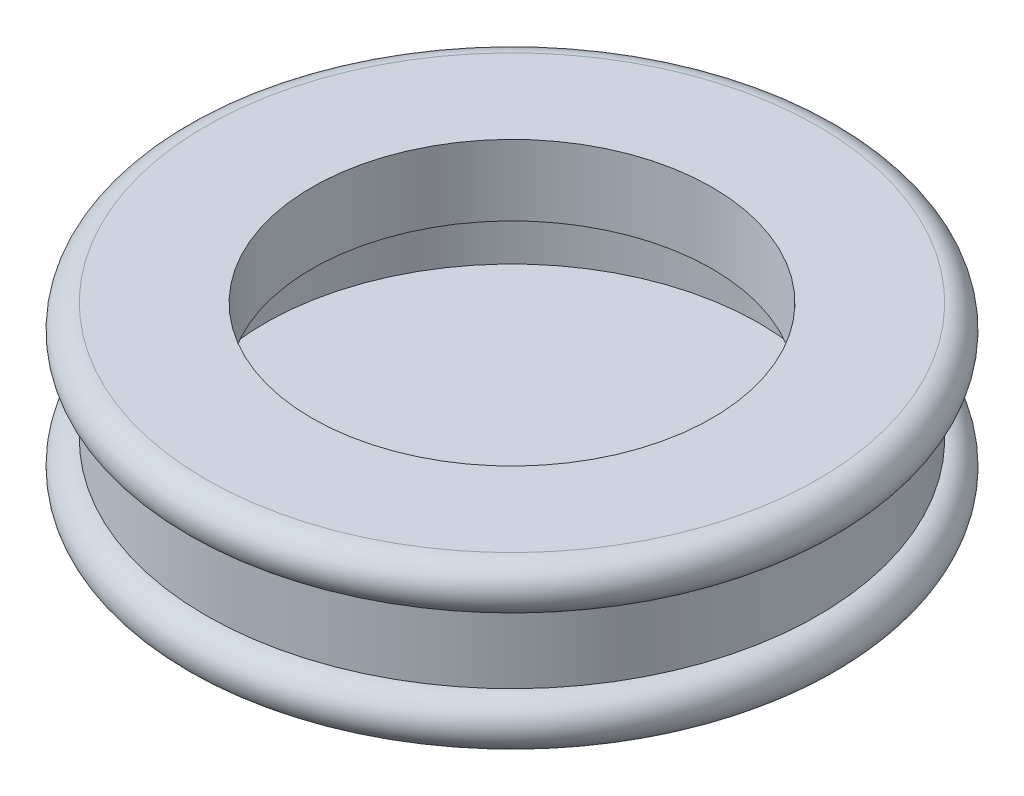
ISO-10303-21;
HEADER;
FILE_DESCRIPTION(('STEP AP214'),'2;1');
FILE_NAME('part.step','',(''),(''),'','','');
FILE_SCHEMA(('AUTOMOTIVE_DESIGN { 1 0 10303 214 1 1 1 1 }'));
ENDSEC;
DATA;
#1=APPLICATION_CONTEXT('core data for automotive mechanical design processes');
#2=APPLICATION_PROTOCOL_DEFINITION('international standard','automotive_design',2000,#1);
#3=PRODUCT_CONTEXT('',#1,'mechanical');
#4=PRODUCT('Part','Part','',(#3));
#5=PRODUCT_RELATED_PRODUCT_CATEGORY('part','',(#4));
#6=PRODUCT_DEFINITION_FORMATION('','',#4);
#7=PRODUCT_DEFINITION_CONTEXT('part definition',#1,'design');
#8=PRODUCT_DEFINITION('design','',#6,#7);
#9=PRODUCT_DEFINITION_SHAPE('','',#8);
#10=(LENGTH_UNIT() NAMED_UNIT(*) SI_UNIT(.MILLI.,.METRE.));
#11=(NAMED_UNIT(*) PLANE_ANGLE_UNIT() SI_UNIT($,.RADIAN.));
#12=(NAMED_UNIT(*) SI_UNIT($,.STERADIAN.) SOLID_ANGLE_UNIT());
#13=UNCERTAINTY_MEASURE_WITH_UNIT(LENGTH_MEASURE(1.E-05),#10,'distance_accuracy_value','');
#14=(GEOMETRIC_REPRESENTATION_CONTEXT(3) GLOBAL_UNCERTAINTY_ASSIGNED_CONTEXT((#13)) GLOBAL_UNIT_ASSIGNED_CONTEXT((#10,
#11,#12)) REPRESENTATION_CONTEXT('',''));
#15=CARTESIAN_POINT('',(0.,0.,0.));
#16=DIRECTION('',(0.,0.,1.));
#17=DIRECTION('',(1.,0.,0.));
#18=AXIS2_PLACEMENT_3D('',#15,#16,#17);
#19=CARTESIAN_POINT('',(0.,0.,0.));
#20=DIRECTION('',(0.,1.,0.));
#21=DIRECTION('',(0.,0.,1.));
#22=AXIS2_PLACEMENT_3D('',#19,#20,#21);
#23=CONICAL_SURFACE('',#22,0.,1.4198658206465);
#24=CARTESIAN_POINT('',(0.,2.,0.));
#25=DIRECTION('',(0.,-1.,0.));
#26=DIRECTION('',(0.,0.,-1.));
#27=AXIS2_PLACEMENT_3D('',#24,#25,#26);
#28=CIRCLE('',#27,13.1503581252133);
#29=CARTESIAN_POINT('',(0.,2.,-13.1503581252134));
#30=VERTEX_POINT('',#29);
#31=EDGE_CURVE('E11',#30,#30,#28,.T.);
#32=ORIENTED_EDGE('',*,*,#31,.T.);
#33=EDGE_LOOP('',(#32));
#34=FACE_BOUND('',#33,.T.);
#35=CARTESIAN_POINT('',(0.,0.,0.));
#36=VERTEX_POINT('',#35);
#37=VERTEX_LOOP('',#36);
#38=FACE_BOUND('',#37,.T.);
#39=ADVANCED_FACE('F42',(#34,#38),#23,.T.);
#40=CARTESIAN_POINT('',(0.,2.98863159679546,0.));
#41=DIRECTION('',(0.,-1.,0.));
#42=DIRECTION('',(0.,0.,-1.));
#43=AXIS2_PLACEMENT_3D('',#40,#41,#42);
#44=TOROIDAL_SURFACE('',#43,13.,1.);
#45=CARTESIAN_POINT('',(0.,3.98863159679546,0.));
#46=DIRECTION('',(0.,-1.,0.));
#47=DIRECTION('',(0.,0.,-1.));
#48=AXIS2_PLACEMENT_3D('',#45,#46,#47);
#49=CIRCLE('',#48,13.);
#50=CARTESIAN_POINT('',(0.,3.98863159679546,-13.));
#51=VERTEX_POINT('',#50);
#52=EDGE_CURVE('E49',#51,#51,#49,.T.);
#53=ORIENTED_EDGE('',*,*,#52,.T.);
#54=EDGE_LOOP('',(#53));
#55=FACE_BOUND('',#54,.T.);
#56=ORIENTED_EDGE('',*,*,#31,.F.);
#57=EDGE_LOOP('',(#56));
#58=FACE_BOUND('',#57,.T.);
#59=ADVANCED_FACE('F53',(#55,#58),#44,.T.);
#60=CARTESIAN_POINT('',(0.,0.,0.));
#61=DIRECTION('',(0.,-1.,0.));
#62=DIRECTION('',(0.,0.,-1.));
#63=AXIS2_PLACEMENT_3D('',#60,#61,#62);
#64=CYLINDRICAL_SURFACE('',#63,13.);
#65=CARTESIAN_POINT('',(0.,6.99838498756551,0.));
#66=DIRECTION('',(0.,-1.,0.));
#67=DIRECTION('',(0.,0.,-1.));
#68=AXIS2_PLACEMENT_3D('',#65,#66,#67);
#69=CIRCLE('',#68,13.);
#70=CARTESIAN_POINT('',(0.,6.99838498756551,-13.));
#71=VERTEX_POINT('',#70);
#72=EDGE_CURVE('E117',#71,#71,#69,.T.);
#73=ORIENTED_EDGE('',*,*,#72,.T.);
#74=EDGE_LOOP('',(#73));
#75=FACE_BOUND('',#74,.T.);
#76=ORIENTED_EDGE('',*,*,#52,.F.);
#77=EDGE_LOOP('',(#76));
#78=FACE_BOUND('',#77,.T.);
#79=ADVANCED_FACE('F58',(#75,#78),#64,.T.);
#80=CARTESIAN_POINT('',(0.,7.99838498756551,0.));
#81=DIRECTION('',(0.,-1.,0.));
#82=DIRECTION('',(0.,0.,-1.));
#83=AXIS2_PLACEMENT_3D('',#80,#81,#82);
#84=TOROIDAL_SURFACE('',#83,13.,1.);
#85=CARTESIAN_POINT('',(0.,8.99838498756551,0.));
#86=DIRECTION('',(0.,-1.,0.));
#87=DIRECTION('',(0.,0.,-1.));
#88=AXIS2_PLACEMENT_3D('',#85,#86,#87);
#89=CIRCLE('',#88,13.);
#90=CARTESIAN_POINT('',(0.,8.99838498756551,-13.));
#91=VERTEX_POINT('',#90);
#92=EDGE_CURVE('E113',#91,#91,#89,.T.);
#93=ORIENTED_EDGE('',*,*,#92,.T.);
#94=EDGE_LOOP('',(#93));
#95=FACE_BOUND('',#94,.T.);
#96=ORIENTED_EDGE('',*,*,#72,.F.);
#97=EDGE_LOOP('',(#96));
#98=FACE_BOUND('',#97,.T.);
#99=ADVANCED_FACE('F65',(#95,#98),#84,.T.);
#100=CARTESIAN_POINT('',(13.,8.99838498756551,0.));
#101=DIRECTION('',(0.,1.,0.));
#102=DIRECTION('',(0.,0.,1.));
#103=AXIS2_PLACEMENT_3D('',#100,#101,#102);
#104=PLANE('',#103);
#105=CARTESIAN_POINT('',(0.,8.99838498756551,0.));
#106=DIRECTION('',(0.,-1.,0.));
#107=DIRECTION('',(0.,0.,-1.));
#108=AXIS2_PLACEMENT_3D('',#105,#106,#107);
#109=CIRCLE('',#108,8.5);
#110=CARTESIAN_POINT('',(0.,8.99838498756551,-8.50000000000003));
#111=VERTEX_POINT('',#110);
#112=EDGE_CURVE('E109',#111,#111,#109,.T.);
#113=ORIENTED_EDGE('',*,*,#112,.T.);
#114=EDGE_LOOP('',(#113));
#115=FACE_BOUND('',#114,.T.);
#116=ORIENTED_EDGE('',*,*,#92,.F.);
#117=EDGE_LOOP('',(#116));
#118=FACE_BOUND('',#117,.T.);
#119=ADVANCED_FACE('F72',(#115,#118),#104,.T.);
#120=CARTESIAN_POINT('',(0.,0.,0.));
#121=DIRECTION('',(0.,-1.,0.));
#122=DIRECTION('',(0.,0.,-1.));
#123=AXIS2_PLACEMENT_3D('',#120,#121,#122);
#124=CYLINDRICAL_SURFACE('',#123,8.5);
#125=CARTESIAN_POINT('',(0.,5.99838498756551,0.));
#126=DIRECTION('',(0.,-1.,0.));
#127=DIRECTION('',(0.,0.,-1.));
#128=AXIS2_PLACEMENT_3D('',#125,#126,#127);
#129=CIRCLE('',#128,8.5);
#130=CARTESIAN_POINT('',(0.,5.99838498756551,-8.50000000000003));
#131=VERTEX_POINT('',#130);
#132=EDGE_CURVE('E103',#131,#131,#129,.T.);
#133=ORIENTED_EDGE('',*,*,#132,.T.);
#134=EDGE_LOOP('',(#133));
#135=FACE_BOUND('',#134,.T.);
#136=ORIENTED_EDGE('',*,*,#112,.F.);
#137=EDGE_LOOP('',(#136));
#138=FACE_BOUND('',#137,.T.);
#139=ADVANCED_FACE('F76',(#135,#138),#124,.F.);
#140=CARTESIAN_POINT('',(10.5000000000001,5.99838498756551,0.));
#141=DIRECTION('',(0.,-1.,0.));
#142=DIRECTION('',(0.,0.,-1.));
#143=AXIS2_PLACEMENT_3D('',#140,#141,#142);
#144=PLANE('',#143);
#145=CARTESIAN_POINT('',(0.,5.99838498756551,0.));
#146=DIRECTION('',(0.,-1.,0.));
#147=DIRECTION('',(0.,0.,-1.));
#148=AXIS2_PLACEMENT_3D('',#145,#146,#147);
#149=CIRCLE('',#148,10.5);
#150=CARTESIAN_POINT('',(0.,5.99838498756551,-10.5));
#151=VERTEX_POINT('',#150);
#152=EDGE_CURVE('E98',#151,#151,#149,.T.);
#153=ORIENTED_EDGE('',*,*,#152,.T.);
#154=EDGE_LOOP('',(#153));
#155=FACE_BOUND('',#154,.T.);
#156=ORIENTED_EDGE('',*,*,#132,.F.);
#157=EDGE_LOOP('',(#156));
#158=FACE_BOUND('',#157,.T.);
#159=ADVANCED_FACE('F80',(#155,#158),#144,.T.);
#160=CARTESIAN_POINT('',(0.,0.,0.));
#161=DIRECTION('',(0.,-1.,0.));
#162=DIRECTION('',(0.,0.,-1.));
#163=AXIS2_PLACEMENT_3D('',#160,#161,#162);
#164=CYLINDRICAL_SURFACE('',#163,10.5);
#165=CARTESIAN_POINT('',(0.,2.99838498756551,0.));
#166=DIRECTION('',(0.,-1.,0.));
#167=DIRECTION('',(0.,0.,-1.));
#168=AXIS2_PLACEMENT_3D('',#165,#166,#167);
#169=CIRCLE('',#168,10.5);
#170=CARTESIAN_POINT('',(0.,2.99838498756551,-10.5));
#171=VERTEX_POINT('',#170);
#172=EDGE_CURVE('E96',#171,#171,#169,.T.);
#173=ORIENTED_EDGE('',*,*,#172,.T.);
#174=EDGE_LOOP('',(#173));
#175=FACE_BOUND('',#174,.T.);
#176=ORIENTED_EDGE('',*,*,#152,.F.);
#177=EDGE_LOOP('',(#176));
#178=FACE_BOUND('',#177,.T.);
#179=ADVANCED_FACE('F84',(#175,#178),#164,.F.);
#180=CARTESIAN_POINT('',(0.,2.99838498756551,0.));
#181=DIRECTION('',(0.,1.,0.));
#182=DIRECTION('',(0.,0.,1.));
#183=AXIS2_PLACEMENT_3D('',#180,#181,#182);
#184=PLANE('',#183);
#185=ORIENTED_EDGE('',*,*,#172,.F.);
#186=EDGE_LOOP('',(#185));
#187=FACE_BOUND('',#186,.T.);
#188=ADVANCED_FACE('F88',(#187),#184,.T.);
#189=CLOSED_SHELL('',(#39,#59,#79,#99,#119,#139,#159,#179,#188));
#190=MANIFOLD_SOLID_BREP('B2',#189);
#191=ADVANCED_BREP_SHAPE_REPRESENTATION('',(#18,#190),#14);
#192=SHAPE_DEFINITION_REPRESENTATION(#9,#191);
ENDSEC;
END-ISO-10303-21;
